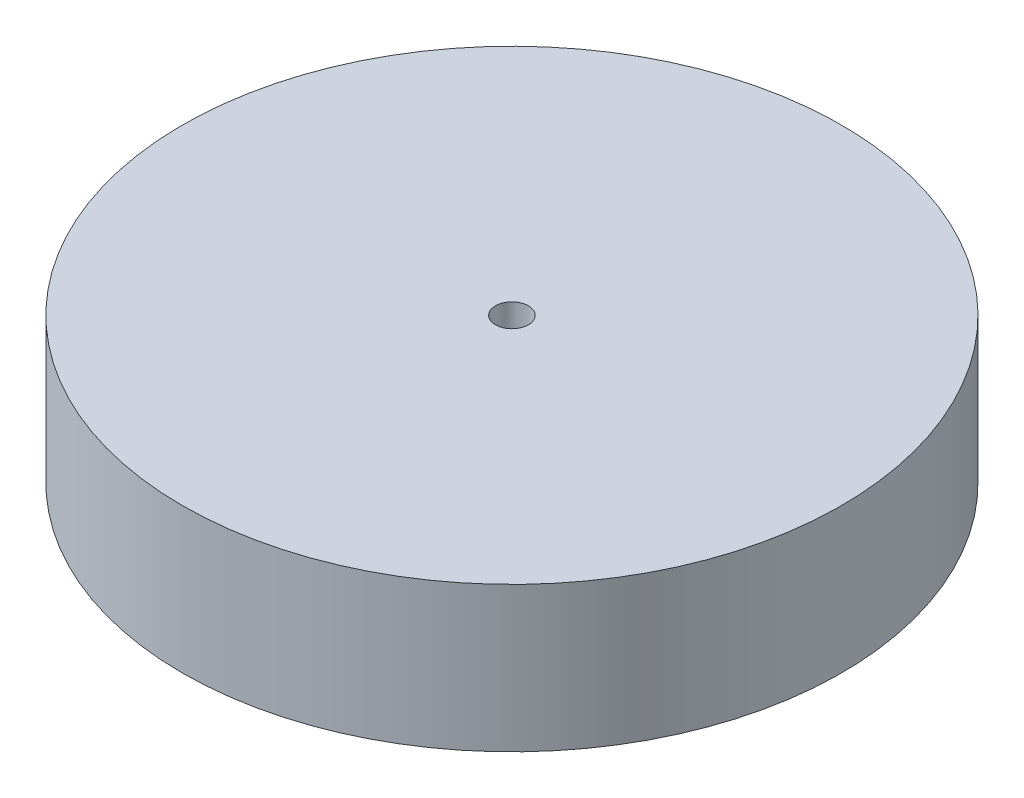
ISO-10303-21;
HEADER;
FILE_DESCRIPTION(('STEP AP214'),'2;1');
FILE_NAME('part.step','',(''),(''),'','','');
FILE_SCHEMA(('AUTOMOTIVE_DESIGN { 1 0 10303 214 1 1 1 1 }'));
ENDSEC;
DATA;
#1=APPLICATION_CONTEXT('core data for automotive mechanical design processes');
#2=APPLICATION_PROTOCOL_DEFINITION('international standard','automotive_design',2000,#1);
#3=PRODUCT_CONTEXT('',#1,'mechanical');
#4=PRODUCT('Part','Part','',(#3));
#5=PRODUCT_RELATED_PRODUCT_CATEGORY('part','',(#4));
#6=PRODUCT_DEFINITION_FORMATION('','',#4);
#7=PRODUCT_DEFINITION_CONTEXT('part definition',#1,'design');
#8=PRODUCT_DEFINITION('design','',#6,#7);
#9=PRODUCT_DEFINITION_SHAPE('','',#8);
#10=(LENGTH_UNIT() NAMED_UNIT(*) SI_UNIT(.MILLI.,.METRE.));
#11=(NAMED_UNIT(*) PLANE_ANGLE_UNIT() SI_UNIT($,.RADIAN.));
#12=(NAMED_UNIT(*) SI_UNIT($,.STERADIAN.) SOLID_ANGLE_UNIT());
#13=UNCERTAINTY_MEASURE_WITH_UNIT(LENGTH_MEASURE(1.E-05),#10,'distance_accuracy_value','');
#14=(GEOMETRIC_REPRESENTATION_CONTEXT(3) GLOBAL_UNCERTAINTY_ASSIGNED_CONTEXT((#13)) GLOBAL_UNIT_ASSIGNED_CONTEXT((#10,
#11,#12)) REPRESENTATION_CONTEXT('',''));
#15=CARTESIAN_POINT('',(0.,0.,0.));
#16=DIRECTION('',(0.,0.,1.));
#17=DIRECTION('',(1.,0.,0.));
#18=AXIS2_PLACEMENT_3D('',#15,#16,#17);
#19=CARTESIAN_POINT('',(0.,15.,0.));
#20=DIRECTION('',(0.,1.,0.));
#21=DIRECTION('',(0.,0.,1.));
#22=AXIS2_PLACEMENT_3D('',#19,#20,#21);
#23=PLANE('',#22);
#24=CARTESIAN_POINT('',(0.,15.,0.));
#25=DIRECTION('',(0.,1.,0.));
#26=DIRECTION('',(0.,0.,1.));
#27=AXIS2_PLACEMENT_3D('',#24,#25,#26);
#28=CIRCLE('',#27,2.5);
#29=CARTESIAN_POINT('',(-2.493901330996,15.,0.174516908224883));
#30=VERTEX_POINT('',#29);
#31=CARTESIAN_POINT('',(-1.65225365597185,15.,1.87618172262914));
#32=VERTEX_POINT('',#31);
#33=EDGE_CURVE('E82',#30,#32,#28,.T.);
#34=ORIENTED_EDGE('',*,*,#33,.T.);
#35=DIRECTION('',(-0.443338953102934,0.,-0.896354044260188));
#36=VECTOR('',#35,1.);
#37=CARTESIAN_POINT('',(-2.07307749348392,15.,1.02534931542701));
#38=LINE('',#37,#36);
#39=EDGE_CURVE('E64',#32,#30,#38,.T.);
#40=ORIENTED_EDGE('',*,*,#39,.T.);
#41=EDGE_LOOP('',(#34,#40));
#42=FACE_BOUND('',#41,.T.);
#43=ADVANCED_FACE('F36',(#42),#23,.T.);
#44=CARTESIAN_POINT('',(0.,22.,0.));
#45=DIRECTION('',(0.,-1.,0.));
#46=DIRECTION('',(0.,0.,-1.));
#47=AXIS2_PLACEMENT_3D('',#44,#45,#46);
#48=CYLINDRICAL_SURFACE('',#47,50.);
#49=CARTESIAN_POINT('',(0.,22.,0.));
#50=DIRECTION('',(0.,1.,0.));
#51=DIRECTION('',(0.,0.,1.));
#52=AXIS2_PLACEMENT_3D('',#49,#50,#51);
#53=CIRCLE('',#52,50.);
#54=CARTESIAN_POINT('',(0.,22.,50.));
#55=VERTEX_POINT('',#54);
#56=EDGE_CURVE('E11',#55,#55,#53,.T.);
#57=ORIENTED_EDGE('',*,*,#56,.F.);
#58=EDGE_LOOP('',(#57));
#59=FACE_BOUND('',#58,.T.);
#60=CARTESIAN_POINT('',(0.,0.,0.));
#61=DIRECTION('',(0.,1.,0.));
#62=DIRECTION('',(0.,0.,1.));
#63=AXIS2_PLACEMENT_3D('',#60,#61,#62);
#64=CIRCLE('',#63,50.);
#65=CARTESIAN_POINT('',(0.,0.,50.));
#66=VERTEX_POINT('',#65);
#67=EDGE_CURVE('E40',#66,#66,#64,.T.);
#68=ORIENTED_EDGE('',*,*,#67,.T.);
#69=EDGE_LOOP('',(#68));
#70=FACE_BOUND('',#69,.T.);
#71=ADVANCED_FACE('F38',(#59,#70),#48,.T.);
#72=CARTESIAN_POINT('',(0.,22.,0.));
#73=DIRECTION('',(0.,1.,0.));
#74=DIRECTION('',(0.,0.,1.));
#75=AXIS2_PLACEMENT_3D('',#72,#73,#74);
#76=PLANE('',#75);
#77=CARTESIAN_POINT('',(0.,22.,0.));
#78=DIRECTION('',(0.,1.,0.));
#79=DIRECTION('',(0.,0.,1.));
#80=AXIS2_PLACEMENT_3D('',#77,#78,#79);
#81=CIRCLE('',#80,2.5);
#82=CARTESIAN_POINT('',(0.,22.,2.5));
#83=VERTEX_POINT('',#82);
#84=EDGE_CURVE('E68',#83,#83,#81,.T.);
#85=ORIENTED_EDGE('',*,*,#84,.F.);
#86=EDGE_LOOP('',(#85));
#87=FACE_BOUND('',#86,.T.);
#88=ORIENTED_EDGE('',*,*,#56,.T.);
#89=EDGE_LOOP('',(#88));
#90=FACE_BOUND('',#89,.T.);
#91=ADVANCED_FACE('F87',(#87,#90),#76,.T.);
#92=CARTESIAN_POINT('',(0.,0.,0.));
#93=DIRECTION('',(0.,1.,0.));
#94=DIRECTION('',(0.,0.,1.));
#95=AXIS2_PLACEMENT_3D('',#92,#93,#94);
#96=PLANE('',#95);
#97=CARTESIAN_POINT('',(0.,0.,0.));
#98=DIRECTION('',(0.,-1.,0.));
#99=DIRECTION('',(0.,0.,-1.));
#100=AXIS2_PLACEMENT_3D('',#97,#98,#99);
#101=CIRCLE('',#100,2.5);
#102=CARTESIAN_POINT('',(-2.493901330996,0.,0.174516908224882));
#103=VERTEX_POINT('',#102);
#104=CARTESIAN_POINT('',(-1.65225365597185,0.,1.87618172262914));
#105=VERTEX_POINT('',#104);
#106=EDGE_CURVE('E71',#103,#105,#101,.T.);
#107=ORIENTED_EDGE('',*,*,#106,.F.);
#108=DIRECTION('',(-0.443338953102934,0.,-0.896354044260188));
#109=VECTOR('',#108,1.);
#110=CARTESIAN_POINT('',(-2.07307749348392,0.,1.02534931542701));
#111=LINE('',#110,#109);
#112=EDGE_CURVE('E56',#105,#103,#111,.T.);
#113=ORIENTED_EDGE('',*,*,#112,.F.);
#114=EDGE_LOOP('',(#107,#113));
#115=FACE_BOUND('',#114,.T.);
#116=ORIENTED_EDGE('',*,*,#67,.F.);
#117=EDGE_LOOP('',(#116));
#118=FACE_BOUND('',#117,.T.);
#119=ADVANCED_FACE('F76',(#115,#118),#96,.F.);
#120=CARTESIAN_POINT('',(0.,15.,0.));
#121=DIRECTION('',(0.,1.,0.));
#122=DIRECTION('',(0.,0.,1.));
#123=AXIS2_PLACEMENT_3D('',#120,#121,#122);
#124=CYLINDRICAL_SURFACE('',#123,2.5);
#125=ORIENTED_EDGE('',*,*,#33,.F.);
#126=DIRECTION('',(0.,-1.,0.));
#127=VECTOR('',#126,1.);
#128=CARTESIAN_POINT('',(-2.493901330996,15.,0.174516908224882));
#129=LINE('',#128,#127);
#130=EDGE_CURVE('E51',#30,#103,#129,.T.);
#131=ORIENTED_EDGE('',*,*,#130,.T.);
#132=ORIENTED_EDGE('',*,*,#106,.T.);
#133=DIRECTION('',(0.,-1.,0.));
#134=VECTOR('',#133,1.);
#135=CARTESIAN_POINT('',(-1.65225365597185,15.,1.87618172262914));
#136=LINE('',#135,#134);
#137=EDGE_CURVE('E61',#32,#105,#136,.T.);
#138=ORIENTED_EDGE('',*,*,#137,.F.);
#139=EDGE_LOOP('',(#125,#131,#132,#138));
#140=FACE_BOUND('',#139,.T.);
#141=ORIENTED_EDGE('',*,*,#84,.T.);
#142=EDGE_LOOP('',(#141));
#143=FACE_BOUND('',#142,.T.);
#144=ADVANCED_FACE('F72',(#140,#143),#124,.F.);
#145=CARTESIAN_POINT('',(-2.07307749348392,15.,1.02534931542701));
#146=DIRECTION('',(-0.896354044260188,0.,0.443338953102934));
#147=DIRECTION('',(0.443338953102934,0.,0.896354044260188));
#148=AXIS2_PLACEMENT_3D('',#145,#146,#147);
#149=PLANE('',#148);
#150=ORIENTED_EDGE('',*,*,#112,.T.);
#151=ORIENTED_EDGE('',*,*,#130,.F.);
#152=ORIENTED_EDGE('',*,*,#39,.F.);
#153=ORIENTED_EDGE('',*,*,#137,.T.);
#154=EDGE_LOOP('',(#150,#151,#152,#153));
#155=FACE_BOUND('',#154,.T.);
#156=ADVANCED_FACE('F63',(#155),#149,.F.);
#157=CLOSED_SHELL('',(#43,#71,#91,#119,#144,#156));
#158=MANIFOLD_SOLID_BREP('B2',#157);
#159=ADVANCED_BREP_SHAPE_REPRESENTATION('',(#18,#158),#14);
#160=SHAPE_DEFINITION_REPRESENTATION(#9,#159);
ENDSEC;
END-ISO-10303-21;
